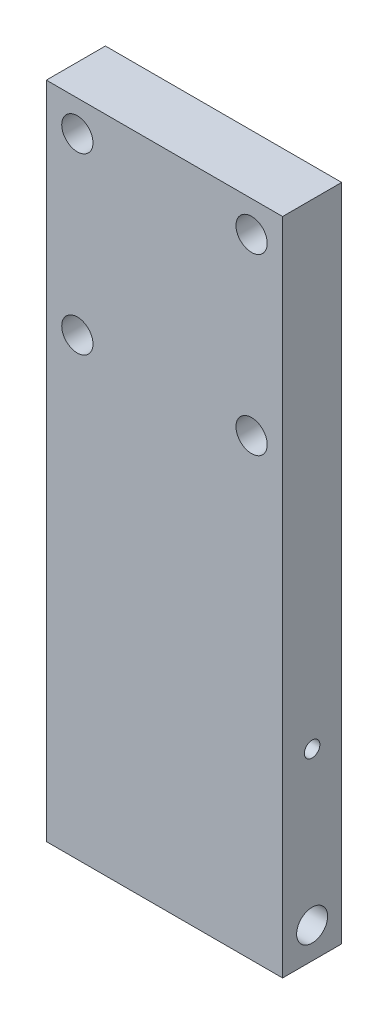
ISO-10303-21;
HEADER;
FILE_DESCRIPTION(('STEP AP214'),'2;1');
FILE_NAME('part.step','',(''),(''),'','','');
FILE_SCHEMA(('AUTOMOTIVE_DESIGN { 1 0 10303 214 1 1 1 1 }'));
ENDSEC;
DATA;
#1=APPLICATION_CONTEXT('core data for automotive mechanical design processes');
#2=APPLICATION_PROTOCOL_DEFINITION('international standard','automotive_design',2000,#1);
#3=PRODUCT_CONTEXT('',#1,'mechanical');
#4=PRODUCT('Part','Part','',(#3));
#5=PRODUCT_RELATED_PRODUCT_CATEGORY('part','',(#4));
#6=PRODUCT_DEFINITION_FORMATION('','',#4);
#7=PRODUCT_DEFINITION_CONTEXT('part definition',#1,'design');
#8=PRODUCT_DEFINITION('design','',#6,#7);
#9=PRODUCT_DEFINITION_SHAPE('','',#8);
#10=(LENGTH_UNIT() NAMED_UNIT(*) SI_UNIT(.MILLI.,.METRE.));
#11=(NAMED_UNIT(*) PLANE_ANGLE_UNIT() SI_UNIT($,.RADIAN.));
#12=(NAMED_UNIT(*) SI_UNIT($,.STERADIAN.) SOLID_ANGLE_UNIT());
#13=UNCERTAINTY_MEASURE_WITH_UNIT(LENGTH_MEASURE(1.E-05),#10,'distance_accuracy_value','');
#14=(GEOMETRIC_REPRESENTATION_CONTEXT(3) GLOBAL_UNCERTAINTY_ASSIGNED_CONTEXT((#13)) GLOBAL_UNIT_ASSIGNED_CONTEXT((#10,
#11,#12)) REPRESENTATION_CONTEXT('',''));
#15=CARTESIAN_POINT('',(0.,0.,0.));
#16=DIRECTION('',(0.,0.,1.));
#17=DIRECTION('',(1.,0.,0.));
#18=AXIS2_PLACEMENT_3D('',#15,#16,#17);
#19=CARTESIAN_POINT('',(-38.1,106.35,-9.525));
#20=DIRECTION('',(1.,0.,0.));
#21=DIRECTION('',(0.,1.,0.));
#22=AXIS2_PLACEMENT_3D('',#19,#20,#21);
#23=PLANE('',#22);
#24=CARTESIAN_POINT('',(-38.1,-96.35,0.));
#25=DIRECTION('',(-1.,0.,0.));
#26=DIRECTION('',(0.,0.,1.));
#27=AXIS2_PLACEMENT_3D('',#24,#25,#26);
#28=CIRCLE('',#27,4.99999999999998);
#29=CARTESIAN_POINT('',(-38.1,-96.35,4.99999999999998));
#30=VERTEX_POINT('',#29);
#31=EDGE_CURVE('E100',#30,#30,#28,.T.);
#32=ORIENTED_EDGE('',*,*,#31,.F.);
#33=EDGE_LOOP('',(#32));
#34=FACE_BOUND('',#33,.T.);
#35=DIRECTION('',(0.,-1.,0.));
#36=VECTOR('',#35,1.);
#37=CARTESIAN_POINT('',(-38.1,106.35,9.525));
#38=LINE('',#37,#36);
#39=CARTESIAN_POINT('',(-38.1,106.35,9.525));
#40=VERTEX_POINT('',#39);
#41=CARTESIAN_POINT('',(-38.1,-106.35,9.525));
#42=VERTEX_POINT('',#41);
#43=EDGE_CURVE('E109',#40,#42,#38,.T.);
#44=ORIENTED_EDGE('',*,*,#43,.F.);
#45=DIRECTION('',(0.,0.,1.));
#46=VECTOR('',#45,1.);
#47=CARTESIAN_POINT('',(-38.1,106.35,-9.525));
#48=LINE('',#47,#46);
#49=CARTESIAN_POINT('',(-38.1,106.35,-9.525));
#50=VERTEX_POINT('',#49);
#51=EDGE_CURVE('E118',#50,#40,#48,.T.);
#52=ORIENTED_EDGE('',*,*,#51,.F.);
#53=DIRECTION('',(0.,-1.,0.));
#54=VECTOR('',#53,1.);
#55=CARTESIAN_POINT('',(-38.1,106.35,-9.525));
#56=LINE('',#55,#54);
#57=CARTESIAN_POINT('',(-38.1,-106.35,-9.525));
#58=VERTEX_POINT('',#57);
#59=EDGE_CURVE('E110',#50,#58,#56,.T.);
#60=ORIENTED_EDGE('',*,*,#59,.T.);
#61=DIRECTION('',(0.,0.,1.));
#62=VECTOR('',#61,1.);
#63=CARTESIAN_POINT('',(-38.1,-106.35,-9.525));
#64=LINE('',#63,#62);
#65=EDGE_CURVE('E11',#58,#42,#64,.T.);
#66=ORIENTED_EDGE('',*,*,#65,.T.);
#67=EDGE_LOOP('',(#44,#52,#60,#66));
#68=FACE_BOUND('',#67,.T.);
#69=ADVANCED_FACE('F39',(#34,#68),#23,.F.);
#70=CARTESIAN_POINT('',(38.1,-106.35,-9.525));
#71=DIRECTION('',(0.,1.,0.));
#72=DIRECTION('',(0.,0.,-1.));
#73=AXIS2_PLACEMENT_3D('',#70,#71,#72);
#74=PLANE('',#73);
#75=DIRECTION('',(1.,0.,0.));
#76=VECTOR('',#75,1.);
#77=CARTESIAN_POINT('',(38.1,-106.35,9.525));
#78=LINE('',#77,#76);
#79=CARTESIAN_POINT('',(38.1,-106.35,9.525));
#80=VERTEX_POINT('',#79);
#81=EDGE_CURVE('E120',#42,#80,#78,.T.);
#82=ORIENTED_EDGE('',*,*,#81,.F.);
#83=ORIENTED_EDGE('',*,*,#65,.F.);
#84=DIRECTION('',(1.,0.,0.));
#85=VECTOR('',#84,1.);
#86=CARTESIAN_POINT('',(38.1,-106.35,-9.525));
#87=LINE('',#86,#85);
#88=CARTESIAN_POINT('',(38.1,-106.35,-9.525));
#89=VERTEX_POINT('',#88);
#90=EDGE_CURVE('E81',#58,#89,#87,.T.);
#91=ORIENTED_EDGE('',*,*,#90,.T.);
#92=DIRECTION('',(0.,0.,1.));
#93=VECTOR('',#92,1.);
#94=CARTESIAN_POINT('',(38.1,-106.35,-9.525));
#95=LINE('',#94,#93);
#96=EDGE_CURVE('E47',#89,#80,#95,.T.);
#97=ORIENTED_EDGE('',*,*,#96,.T.);
#98=EDGE_LOOP('',(#82,#83,#91,#97));
#99=FACE_BOUND('',#98,.T.);
#100=ADVANCED_FACE('F131',(#99),#74,.F.);
#101=CARTESIAN_POINT('',(38.1,106.35,-9.525));
#102=DIRECTION('',(-1.,0.,0.));
#103=DIRECTION('',(0.,-1.,0.));
#104=AXIS2_PLACEMENT_3D('',#101,#102,#103);
#105=PLANE('',#104);
#106=CARTESIAN_POINT('',(38.1,-47.1499999999982,2.3850140612458E-11));
#107=DIRECTION('',(-1.,0.,0.));
#108=DIRECTION('',(0.,0.,1.));
#109=AXIS2_PLACEMENT_3D('',#106,#107,#108);
#110=CIRCLE('',#109,2.49999999999999);
#111=CARTESIAN_POINT('',(38.1,-47.1499999999982,2.50000000002384));
#112=VERTEX_POINT('',#111);
#113=EDGE_CURVE('E97',#112,#112,#110,.T.);
#114=ORIENTED_EDGE('',*,*,#113,.T.);
#115=EDGE_LOOP('',(#114));
#116=FACE_BOUND('',#115,.T.);
#117=CARTESIAN_POINT('',(38.1,-96.35,0.));
#118=DIRECTION('',(-1.,0.,0.));
#119=DIRECTION('',(0.,0.,1.));
#120=AXIS2_PLACEMENT_3D('',#117,#118,#119);
#121=CIRCLE('',#120,4.99999999999999);
#122=CARTESIAN_POINT('',(38.1,-96.35,4.99999999999999));
#123=VERTEX_POINT('',#122);
#124=EDGE_CURVE('E96',#123,#123,#121,.T.);
#125=ORIENTED_EDGE('',*,*,#124,.T.);
#126=EDGE_LOOP('',(#125));
#127=FACE_BOUND('',#126,.T.);
#128=DIRECTION('',(0.,1.,0.));
#129=VECTOR('',#128,1.);
#130=CARTESIAN_POINT('',(38.1,106.35,9.525));
#131=LINE('',#130,#129);
#132=CARTESIAN_POINT('',(38.1,106.35,9.525));
#133=VERTEX_POINT('',#132);
#134=EDGE_CURVE('E123',#80,#133,#131,.T.);
#135=ORIENTED_EDGE('',*,*,#134,.F.);
#136=ORIENTED_EDGE('',*,*,#96,.F.);
#137=DIRECTION('',(0.,1.,0.));
#138=VECTOR('',#137,1.);
#139=CARTESIAN_POINT('',(38.1,106.35,-9.525));
#140=LINE('',#139,#138);
#141=CARTESIAN_POINT('',(38.1,106.35,-9.525));
#142=VERTEX_POINT('',#141);
#143=EDGE_CURVE('E114',#89,#142,#140,.T.);
#144=ORIENTED_EDGE('',*,*,#143,.T.);
#145=DIRECTION('',(0.,0.,1.));
#146=VECTOR('',#145,1.);
#147=CARTESIAN_POINT('',(38.1,106.35,-9.525));
#148=LINE('',#147,#146);
#149=EDGE_CURVE('E127',#142,#133,#148,.T.);
#150=ORIENTED_EDGE('',*,*,#149,.T.);
#151=EDGE_LOOP('',(#135,#136,#144,#150));
#152=FACE_BOUND('',#151,.T.);
#153=ADVANCED_FACE('F139',(#116,#127,#152),#105,.F.);
#154=CARTESIAN_POINT('',(38.1,106.35,-9.525));
#155=DIRECTION('',(0.,-1.,0.));
#156=DIRECTION('',(0.,0.,1.));
#157=AXIS2_PLACEMENT_3D('',#154,#155,#156);
#158=PLANE('',#157);
#159=DIRECTION('',(-1.,0.,0.));
#160=VECTOR('',#159,1.);
#161=CARTESIAN_POINT('',(38.1,106.35,9.525));
#162=LINE('',#161,#160);
#163=EDGE_CURVE('E70',#133,#40,#162,.T.);
#164=ORIENTED_EDGE('',*,*,#163,.F.);
#165=ORIENTED_EDGE('',*,*,#149,.F.);
#166=DIRECTION('',(-1.,0.,0.));
#167=VECTOR('',#166,1.);
#168=CARTESIAN_POINT('',(38.1,106.35,-9.525));
#169=LINE('',#168,#167);
#170=EDGE_CURVE('E55',#142,#50,#169,.T.);
#171=ORIENTED_EDGE('',*,*,#170,.T.);
#172=ORIENTED_EDGE('',*,*,#51,.T.);
#173=EDGE_LOOP('',(#164,#165,#171,#172));
#174=FACE_BOUND('',#173,.T.);
#175=ADVANCED_FACE('F138',(#174),#158,.F.);
#176=CARTESIAN_POINT('',(0.,0.,-9.525));
#177=DIRECTION('',(0.,0.,1.));
#178=DIRECTION('',(-1.,0.,0.));
#179=AXIS2_PLACEMENT_3D('',#176,#177,#178);
#180=PLANE('',#179);
#181=CARTESIAN_POINT('',(28.1,96.35,-9.525));
#182=DIRECTION('',(0.,0.,-1.));
#183=DIRECTION('',(-1.,0.,0.));
#184=AXIS2_PLACEMENT_3D('',#181,#182,#183);
#185=CIRCLE('',#184,5.04189999999999);
#186=CARTESIAN_POINT('',(23.0581,96.35,-9.525));
#187=VERTEX_POINT('',#186);
#188=EDGE_CURVE('E173',#187,#187,#185,.T.);
#189=ORIENTED_EDGE('',*,*,#188,.F.);
#190=EDGE_LOOP('',(#189));
#191=FACE_BOUND('',#190,.T.);
#192=CARTESIAN_POINT('',(28.1,40.15,-9.525));
#193=DIRECTION('',(0.,0.,-1.));
#194=DIRECTION('',(-1.,0.,0.));
#195=AXIS2_PLACEMENT_3D('',#192,#193,#194);
#196=CIRCLE('',#195,5.04189999999999);
#197=CARTESIAN_POINT('',(23.0581,40.15,-9.525));
#198=VERTEX_POINT('',#197);
#199=EDGE_CURVE('E177',#198,#198,#196,.T.);
#200=ORIENTED_EDGE('',*,*,#199,.F.);
#201=EDGE_LOOP('',(#200));
#202=FACE_BOUND('',#201,.T.);
#203=CARTESIAN_POINT('',(-28.1,40.15,-9.525));
#204=DIRECTION('',(0.,0.,-1.));
#205=DIRECTION('',(-1.,0.,0.));
#206=AXIS2_PLACEMENT_3D('',#203,#204,#205);
#207=CIRCLE('',#206,5.04189999999999);
#208=CARTESIAN_POINT('',(-33.1419,40.15,-9.525));
#209=VERTEX_POINT('',#208);
#210=EDGE_CURVE('E181',#209,#209,#207,.T.);
#211=ORIENTED_EDGE('',*,*,#210,.F.);
#212=EDGE_LOOP('',(#211));
#213=FACE_BOUND('',#212,.T.);
#214=CARTESIAN_POINT('',(-28.1,96.35,-9.525));
#215=DIRECTION('',(0.,0.,-1.));
#216=DIRECTION('',(-1.,0.,0.));
#217=AXIS2_PLACEMENT_3D('',#214,#215,#216);
#218=CIRCLE('',#217,5.04189999999999);
#219=CARTESIAN_POINT('',(-33.1419,96.35,-9.525));
#220=VERTEX_POINT('',#219);
#221=EDGE_CURVE('E103',#220,#220,#218,.T.);
#222=ORIENTED_EDGE('',*,*,#221,.F.);
#223=EDGE_LOOP('',(#222));
#224=FACE_BOUND('',#223,.T.);
#225=ORIENTED_EDGE('',*,*,#59,.F.);
#226=ORIENTED_EDGE('',*,*,#170,.F.);
#227=ORIENTED_EDGE('',*,*,#143,.F.);
#228=ORIENTED_EDGE('',*,*,#90,.F.);
#229=EDGE_LOOP('',(#225,#226,#227,#228));
#230=FACE_BOUND('',#229,.T.);
#231=ADVANCED_FACE('F137',(#191,#202,#213,#224,#230),#180,.F.);
#232=CARTESIAN_POINT('',(0.,0.,9.525));
#233=DIRECTION('',(0.,0.,1.));
#234=DIRECTION('',(-1.,0.,0.));
#235=AXIS2_PLACEMENT_3D('',#232,#233,#234);
#236=PLANE('',#235);
#237=CARTESIAN_POINT('',(28.1,96.35,9.525));
#238=DIRECTION('',(0.,0.,-1.));
#239=DIRECTION('',(-1.,0.,0.));
#240=AXIS2_PLACEMENT_3D('',#237,#238,#239);
#241=CIRCLE('',#240,5.04189999999999);
#242=CARTESIAN_POINT('',(23.0581,96.35,9.525));
#243=VERTEX_POINT('',#242);
#244=EDGE_CURVE('E198',#243,#243,#241,.T.);
#245=ORIENTED_EDGE('',*,*,#244,.T.);
#246=EDGE_LOOP('',(#245));
#247=FACE_BOUND('',#246,.T.);
#248=CARTESIAN_POINT('',(28.1,40.15,9.525));
#249=DIRECTION('',(0.,0.,-1.));
#250=DIRECTION('',(-1.,0.,0.));
#251=AXIS2_PLACEMENT_3D('',#248,#249,#250);
#252=CIRCLE('',#251,5.04189999999999);
#253=CARTESIAN_POINT('',(23.0581,40.15,9.525));
#254=VERTEX_POINT('',#253);
#255=EDGE_CURVE('E194',#254,#254,#252,.T.);
#256=ORIENTED_EDGE('',*,*,#255,.T.);
#257=EDGE_LOOP('',(#256));
#258=FACE_BOUND('',#257,.T.);
#259=CARTESIAN_POINT('',(-28.1,40.15,9.525));
#260=DIRECTION('',(0.,0.,-1.));
#261=DIRECTION('',(-1.,0.,0.));
#262=AXIS2_PLACEMENT_3D('',#259,#260,#261);
#263=CIRCLE('',#262,5.04189999999999);
#264=CARTESIAN_POINT('',(-33.1419,40.15,9.525));
#265=VERTEX_POINT('',#264);
#266=EDGE_CURVE('E190',#265,#265,#263,.T.);
#267=ORIENTED_EDGE('',*,*,#266,.T.);
#268=EDGE_LOOP('',(#267));
#269=FACE_BOUND('',#268,.T.);
#270=CARTESIAN_POINT('',(-28.1,96.35,9.525));
#271=DIRECTION('',(0.,0.,-1.));
#272=DIRECTION('',(-1.,0.,0.));
#273=AXIS2_PLACEMENT_3D('',#270,#271,#272);
#274=CIRCLE('',#273,5.04189999999999);
#275=CARTESIAN_POINT('',(-33.1419,96.35,9.525));
#276=VERTEX_POINT('',#275);
#277=EDGE_CURVE('E185',#276,#276,#274,.T.);
#278=ORIENTED_EDGE('',*,*,#277,.T.);
#279=EDGE_LOOP('',(#278));
#280=FACE_BOUND('',#279,.T.);
#281=ORIENTED_EDGE('',*,*,#43,.T.);
#282=ORIENTED_EDGE('',*,*,#81,.T.);
#283=ORIENTED_EDGE('',*,*,#134,.T.);
#284=ORIENTED_EDGE('',*,*,#163,.T.);
#285=EDGE_LOOP('',(#281,#282,#283,#284));
#286=FACE_BOUND('',#285,.T.);
#287=ADVANCED_FACE('F133',(#247,#258,#269,#280,#286),#236,.T.);
#288=CARTESIAN_POINT('',(38.1,-96.35,0.));
#289=DIRECTION('',(1.,0.,0.));
#290=DIRECTION('',(0.,0.,1.));
#291=AXIS2_PLACEMENT_3D('',#288,#289,#290);
#292=CYLINDRICAL_SURFACE('',#291,4.99999999999998);
#293=ORIENTED_EDGE('',*,*,#31,.T.);
#294=EDGE_LOOP('',(#293));
#295=FACE_BOUND('',#294,.T.);
#296=ORIENTED_EDGE('',*,*,#124,.F.);
#297=EDGE_LOOP('',(#296));
#298=FACE_BOUND('',#297,.T.);
#299=ADVANCED_FACE('F90',(#295,#298),#292,.F.);
#300=CARTESIAN_POINT('',(28.1,-47.1499999999982,2.3850140612458E-11));
#301=DIRECTION('',(1.,0.,0.));
#302=DIRECTION('',(0.,0.,1.));
#303=AXIS2_PLACEMENT_3D('',#300,#301,#302);
#304=CONICAL_SURFACE('',#303,2.5,1.02974425867665);
#305=CARTESIAN_POINT('',(26.5978484524311,-47.1499999999982,2.3850140612458E-11));
#306=VERTEX_POINT('',#305);
#307=VERTEX_LOOP('',#306);
#308=FACE_BOUND('',#307,.T.);
#309=CARTESIAN_POINT('',(28.1,-47.1499999999982,2.3850140612458E-11));
#310=DIRECTION('',(-1.,0.,0.));
#311=DIRECTION('',(0.,0.,1.));
#312=AXIS2_PLACEMENT_3D('',#309,#310,#311);
#313=CIRCLE('',#312,2.5);
#314=CARTESIAN_POINT('',(28.1,-47.1499999999982,2.50000000002385));
#315=VERTEX_POINT('',#314);
#316=EDGE_CURVE('E94',#315,#315,#313,.T.);
#317=ORIENTED_EDGE('',*,*,#316,.F.);
#318=EDGE_LOOP('',(#317));
#319=FACE_BOUND('',#318,.T.);
#320=ADVANCED_FACE('F86',(#308,#319),#304,.F.);
#321=CARTESIAN_POINT('',(38.1,-47.1499999999982,2.3850140612458E-11));
#322=DIRECTION('',(1.,0.,0.));
#323=DIRECTION('',(0.,0.,1.));
#324=AXIS2_PLACEMENT_3D('',#321,#322,#323);
#325=CYLINDRICAL_SURFACE('',#324,2.49999999999999);
#326=ORIENTED_EDGE('',*,*,#316,.T.);
#327=EDGE_LOOP('',(#326));
#328=FACE_BOUND('',#327,.T.);
#329=ORIENTED_EDGE('',*,*,#113,.F.);
#330=EDGE_LOOP('',(#329));
#331=FACE_BOUND('',#330,.T.);
#332=ADVANCED_FACE('F89',(#328,#331),#325,.F.);
#333=CARTESIAN_POINT('',(-28.1,96.35,9.525));
#334=DIRECTION('',(0.,0.,1.));
#335=DIRECTION('',(-1.,0.,0.));
#336=AXIS2_PLACEMENT_3D('',#333,#334,#335);
#337=CYLINDRICAL_SURFACE('',#336,5.04189999999999);
#338=ORIENTED_EDGE('',*,*,#221,.T.);
#339=EDGE_LOOP('',(#338));
#340=FACE_BOUND('',#339,.T.);
#341=ORIENTED_EDGE('',*,*,#277,.F.);
#342=EDGE_LOOP('',(#341));
#343=FACE_BOUND('',#342,.T.);
#344=ADVANCED_FACE('F217',(#340,#343),#337,.F.);
#345=CARTESIAN_POINT('',(-28.1,40.15,9.525));
#346=DIRECTION('',(0.,0.,1.));
#347=DIRECTION('',(-1.,0.,0.));
#348=AXIS2_PLACEMENT_3D('',#345,#346,#347);
#349=CYLINDRICAL_SURFACE('',#348,5.04189999999999);
#350=ORIENTED_EDGE('',*,*,#210,.T.);
#351=EDGE_LOOP('',(#350));
#352=FACE_BOUND('',#351,.T.);
#353=ORIENTED_EDGE('',*,*,#266,.F.);
#354=EDGE_LOOP('',(#353));
#355=FACE_BOUND('',#354,.T.);
#356=ADVANCED_FACE('F211',(#352,#355),#349,.F.);
#357=CARTESIAN_POINT('',(28.1,40.15,9.525));
#358=DIRECTION('',(0.,0.,1.));
#359=DIRECTION('',(-1.,0.,0.));
#360=AXIS2_PLACEMENT_3D('',#357,#358,#359);
#361=CYLINDRICAL_SURFACE('',#360,5.04189999999999);
#362=ORIENTED_EDGE('',*,*,#199,.T.);
#363=EDGE_LOOP('',(#362));
#364=FACE_BOUND('',#363,.T.);
#365=ORIENTED_EDGE('',*,*,#255,.F.);
#366=EDGE_LOOP('',(#365));
#367=FACE_BOUND('',#366,.T.);
#368=ADVANCED_FACE('F205',(#364,#367),#361,.F.);
#369=CARTESIAN_POINT('',(28.1,96.35,9.525));
#370=DIRECTION('',(0.,0.,1.));
#371=DIRECTION('',(-1.,0.,0.));
#372=AXIS2_PLACEMENT_3D('',#369,#370,#371);
#373=CYLINDRICAL_SURFACE('',#372,5.04189999999999);
#374=ORIENTED_EDGE('',*,*,#188,.T.);
#375=EDGE_LOOP('',(#374));
#376=FACE_BOUND('',#375,.T.);
#377=ORIENTED_EDGE('',*,*,#244,.F.);
#378=EDGE_LOOP('',(#377));
#379=FACE_BOUND('',#378,.T.);
#380=ADVANCED_FACE('F203',(#376,#379),#373,.F.);
#381=CLOSED_SHELL('',(#69,#100,#153,#175,#231,#287,#299,#320,#332,#344,#356,#368,#380));
#382=MANIFOLD_SOLID_BREP('B2',#381);
#383=ADVANCED_BREP_SHAPE_REPRESENTATION('',(#18,#382),#14);
#384=SHAPE_DEFINITION_REPRESENTATION(#9,#383);
ENDSEC;
END-ISO-10303-21;
